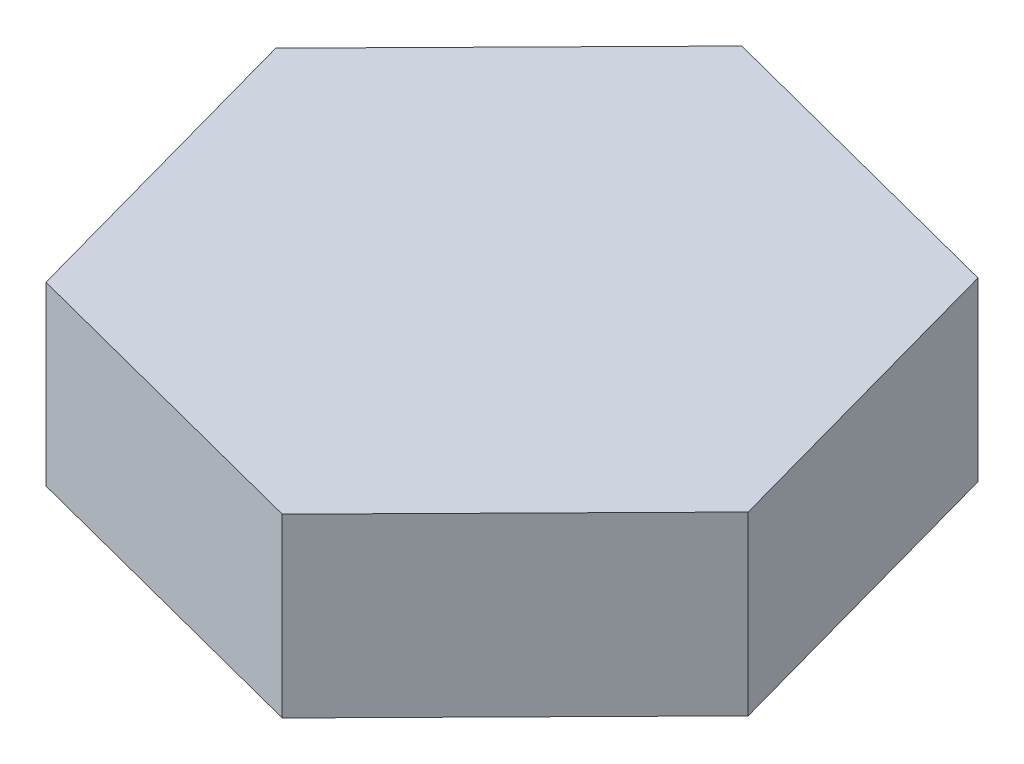
ISO-10303-21;
HEADER;
FILE_DESCRIPTION(('STEP AP214'),'2;1');
FILE_NAME('part.step','',(''),(''),'','','');
FILE_SCHEMA(('AUTOMOTIVE_DESIGN { 1 0 10303 214 1 1 1 1 }'));
ENDSEC;
DATA;
#1=APPLICATION_CONTEXT('core data for automotive mechanical design processes');
#2=APPLICATION_PROTOCOL_DEFINITION('international standard','automotive_design',2000,#1);
#3=PRODUCT_CONTEXT('',#1,'mechanical');
#4=PRODUCT('Part','Part','',(#3));
#5=PRODUCT_RELATED_PRODUCT_CATEGORY('part','',(#4));
#6=PRODUCT_DEFINITION_FORMATION('','',#4);
#7=PRODUCT_DEFINITION_CONTEXT('part definition',#1,'design');
#8=PRODUCT_DEFINITION('design','',#6,#7);
#9=PRODUCT_DEFINITION_SHAPE('','',#8);
#10=(LENGTH_UNIT() NAMED_UNIT(*) SI_UNIT(.MILLI.,.METRE.));
#11=(NAMED_UNIT(*) PLANE_ANGLE_UNIT() SI_UNIT($,.RADIAN.));
#12=(NAMED_UNIT(*) SI_UNIT($,.STERADIAN.) SOLID_ANGLE_UNIT());
#13=UNCERTAINTY_MEASURE_WITH_UNIT(LENGTH_MEASURE(1.E-05),#10,'distance_accuracy_value','');
#14=(GEOMETRIC_REPRESENTATION_CONTEXT(3) GLOBAL_UNCERTAINTY_ASSIGNED_CONTEXT((#13)) GLOBAL_UNIT_ASSIGNED_CONTEXT((#10,
#11,#12)) REPRESENTATION_CONTEXT('',''));
#15=CARTESIAN_POINT('',(0.,0.,0.));
#16=DIRECTION('',(0.,0.,1.));
#17=DIRECTION('',(1.,0.,0.));
#18=AXIS2_PLACEMENT_3D('',#15,#16,#17);
#19=CARTESIAN_POINT('',(22.1413968795443,3.,-2.38203916015197));
#20=DIRECTION('',(0.25103526460217,0.,-0.967977941859275));
#21=DIRECTION('',(-0.967977941859276,0.,-0.25103526460217));
#22=AXIS2_PLACEMENT_3D('',#19,#20,#21);
#23=PLANE('',#22);
#24=DIRECTION('',(0.967977941859275,0.,0.25103526460217));
#25=VECTOR('',#24,1.);
#26=CARTESIAN_POINT('',(22.1413968795443,0.,-2.38203916015197));
#27=LINE('',#26,#25);
#28=CARTESIAN_POINT('',(22.1413968795443,0.,-2.38203916015197));
#29=VERTEX_POINT('',#28);
#30=CARTESIAN_POINT('',(27.5623614349744,0.,-0.9761669674887));
#31=VERTEX_POINT('',#30);
#32=EDGE_CURVE('E117',#29,#31,#27,.T.);
#33=ORIENTED_EDGE('',*,*,#32,.T.);
#34=DIRECTION('',(0.,-1.,0.));
#35=VECTOR('',#34,1.);
#36=CARTESIAN_POINT('',(27.5623614349744,3.,-0.9761669674887));
#37=LINE('',#36,#35);
#38=CARTESIAN_POINT('',(27.5623614349744,3.,-0.9761669674887));
#39=VERTEX_POINT('',#38);
#40=EDGE_CURVE('E11',#39,#31,#37,.T.);
#41=ORIENTED_EDGE('',*,*,#40,.F.);
#42=DIRECTION('',(0.967977941859275,0.,0.25103526460217));
#43=VECTOR('',#42,1.);
#44=CARTESIAN_POINT('',(22.1413968795443,3.,-2.38203916015197));
#45=LINE('',#44,#43);
#46=CARTESIAN_POINT('',(22.1413968795443,3.,-2.38203916015197));
#47=VERTEX_POINT('',#46);
#48=EDGE_CURVE('E127',#47,#39,#45,.T.);
#49=ORIENTED_EDGE('',*,*,#48,.F.);
#50=DIRECTION('',(0.,-1.,0.));
#51=VECTOR('',#50,1.);
#52=CARTESIAN_POINT('',(22.1413968795443,3.,-2.38203916015197));
#53=LINE('',#52,#51);
#54=EDGE_CURVE('E113',#47,#29,#53,.T.);
#55=ORIENTED_EDGE('',*,*,#54,.T.);
#56=EDGE_LOOP('',(#33,#41,#49,#55));
#57=FACE_BOUND('',#56,.T.);
#58=ADVANCED_FACE('F33',(#57),#23,.F.);
#59=CARTESIAN_POINT('',(27.5623614349744,3.,-0.9761669674887));
#60=DIRECTION('',(-0.712775855652024,0.,-0.701391887320865));
#61=DIRECTION('',(-0.701391887320865,0.,0.712775855652024));
#62=AXIS2_PLACEMENT_3D('',#59,#60,#61);
#63=PLANE('',#62);
#64=DIRECTION('',(0.701391887320865,0.,-0.712775855652024));
#65=VECTOR('',#64,1.);
#66=CARTESIAN_POINT('',(27.5623614349744,0.,-0.9761669674887));
#67=LINE('',#66,#65);
#68=CARTESIAN_POINT('',(31.49036474601,0.,-4.96792388917455));
#69=VERTEX_POINT('',#68);
#70=EDGE_CURVE('E120',#31,#69,#67,.T.);
#71=ORIENTED_EDGE('',*,*,#70,.T.);
#72=DIRECTION('',(0.,-1.,0.));
#73=VECTOR('',#72,1.);
#74=CARTESIAN_POINT('',(31.49036474601,3.,-4.96792388917455));
#75=LINE('',#74,#73);
#76=CARTESIAN_POINT('',(31.49036474601,3.,-4.96792388917455));
#77=VERTEX_POINT('',#76);
#78=EDGE_CURVE('E41',#77,#69,#75,.T.);
#79=ORIENTED_EDGE('',*,*,#78,.F.);
#80=DIRECTION('',(0.701391887320865,0.,-0.712775855652024));
#81=VECTOR('',#80,1.);
#82=CARTESIAN_POINT('',(27.5623614349744,3.,-0.9761669674887));
#83=LINE('',#82,#81);
#84=EDGE_CURVE('E86',#39,#77,#83,.T.);
#85=ORIENTED_EDGE('',*,*,#84,.F.);
#86=ORIENTED_EDGE('',*,*,#40,.T.);
#87=EDGE_LOOP('',(#71,#79,#85,#86));
#88=FACE_BOUND('',#87,.T.);
#89=ADVANCED_FACE('F151',(#88),#63,.F.);
#90=CARTESIAN_POINT('',(31.49036474601,3.,-4.96792388917455));
#91=DIRECTION('',(-0.963811120254194,0.,0.26658605453841));
#92=DIRECTION('',(0.26658605453841,0.,0.963811120254194));
#93=AXIS2_PLACEMENT_3D('',#90,#91,#92);
#94=PLANE('',#93);
#95=DIRECTION('',(-0.26658605453841,0.,-0.963811120254194));
#96=VECTOR('',#95,1.);
#97=CARTESIAN_POINT('',(31.49036474601,0.,-4.96792388917455));
#98=LINE('',#97,#96);
#99=CARTESIAN_POINT('',(29.9974035016154,0.,-10.3655530035237));
#100=VERTEX_POINT('',#99);
#101=EDGE_CURVE('E122',#69,#100,#98,.T.);
#102=ORIENTED_EDGE('',*,*,#101,.T.);
#103=DIRECTION('',(0.,-1.,0.));
#104=VECTOR('',#103,1.);
#105=CARTESIAN_POINT('',(29.9974035016154,3.,-10.3655530035237));
#106=LINE('',#105,#104);
#107=CARTESIAN_POINT('',(29.9974035016154,3.,-10.3655530035237));
#108=VERTEX_POINT('',#107);
#109=EDGE_CURVE('E108',#108,#100,#106,.T.);
#110=ORIENTED_EDGE('',*,*,#109,.F.);
#111=DIRECTION('',(-0.26658605453841,0.,-0.963811120254194));
#112=VECTOR('',#111,1.);
#113=CARTESIAN_POINT('',(31.49036474601,3.,-4.96792388917455));
#114=LINE('',#113,#112);
#115=EDGE_CURVE('E99',#77,#108,#114,.T.);
#116=ORIENTED_EDGE('',*,*,#115,.F.);
#117=ORIENTED_EDGE('',*,*,#78,.T.);
#118=EDGE_LOOP('',(#102,#110,#116,#117));
#119=FACE_BOUND('',#118,.T.);
#120=ADVANCED_FACE('F133',(#119),#94,.F.);
#121=CARTESIAN_POINT('',(29.9974035016154,3.,-10.3655530035237));
#122=DIRECTION('',(-0.25103526460217,0.,0.967977941859275));
#123=DIRECTION('',(0.967977941859276,0.,0.25103526460217));
#124=AXIS2_PLACEMENT_3D('',#121,#122,#123);
#125=PLANE('',#124);
#126=DIRECTION('',(-0.967977941859275,0.,-0.25103526460217));
#127=VECTOR('',#126,1.);
#128=CARTESIAN_POINT('',(29.9974035016154,0.,-10.3655530035237));
#129=LINE('',#128,#127);
#130=CARTESIAN_POINT('',(24.5764389461853,0.,-11.7714251961869));
#131=VERTEX_POINT('',#130);
#132=EDGE_CURVE('E107',#100,#131,#129,.T.);
#133=ORIENTED_EDGE('',*,*,#132,.T.);
#134=DIRECTION('',(0.,-1.,0.));
#135=VECTOR('',#134,1.);
#136=CARTESIAN_POINT('',(24.5764389461853,3.,-11.7714251961869));
#137=LINE('',#136,#135);
#138=CARTESIAN_POINT('',(24.5764389461853,3.,-11.7714251961869));
#139=VERTEX_POINT('',#138);
#140=EDGE_CURVE('E104',#139,#131,#137,.T.);
#141=ORIENTED_EDGE('',*,*,#140,.F.);
#142=DIRECTION('',(-0.967977941859275,0.,-0.25103526460217));
#143=VECTOR('',#142,1.);
#144=CARTESIAN_POINT('',(29.9974035016154,3.,-10.3655530035237));
#145=LINE('',#144,#143);
#146=EDGE_CURVE('E93',#108,#139,#145,.T.);
#147=ORIENTED_EDGE('',*,*,#146,.F.);
#148=ORIENTED_EDGE('',*,*,#109,.T.);
#149=EDGE_LOOP('',(#133,#141,#147,#148));
#150=FACE_BOUND('',#149,.T.);
#151=ADVANCED_FACE('F105',(#150),#125,.F.);
#152=CARTESIAN_POINT('',(24.5764389461853,3.,-11.7714251961869));
#153=DIRECTION('',(0.712775855652024,0.,0.701391887320865));
#154=DIRECTION('',(0.701391887320865,0.,-0.712775855652024));
#155=AXIS2_PLACEMENT_3D('',#152,#153,#154);
#156=PLANE('',#155);
#157=DIRECTION('',(-0.701391887320865,0.,0.712775855652024));
#158=VECTOR('',#157,1.);
#159=CARTESIAN_POINT('',(24.5764389461853,0.,-11.7714251961869));
#160=LINE('',#159,#158);
#161=CARTESIAN_POINT('',(20.6484356351498,0.,-7.77966827450109));
#162=VERTEX_POINT('',#161);
#163=EDGE_CURVE('E72',#131,#162,#160,.T.);
#164=ORIENTED_EDGE('',*,*,#163,.T.);
#165=DIRECTION('',(0.,-1.,0.));
#166=VECTOR('',#165,1.);
#167=CARTESIAN_POINT('',(20.6484356351498,3.,-7.77966827450109));
#168=LINE('',#167,#166);
#169=CARTESIAN_POINT('',(20.6484356351498,3.,-7.77966827450109));
#170=VERTEX_POINT('',#169);
#171=EDGE_CURVE('E109',#170,#162,#168,.T.);
#172=ORIENTED_EDGE('',*,*,#171,.F.);
#173=DIRECTION('',(-0.701391887320865,0.,0.712775855652024));
#174=VECTOR('',#173,1.);
#175=CARTESIAN_POINT('',(24.5764389461853,3.,-11.7714251961869));
#176=LINE('',#175,#174);
#177=EDGE_CURVE('E97',#139,#170,#176,.T.);
#178=ORIENTED_EDGE('',*,*,#177,.F.);
#179=ORIENTED_EDGE('',*,*,#140,.T.);
#180=EDGE_LOOP('',(#164,#172,#178,#179));
#181=FACE_BOUND('',#180,.T.);
#182=ADVANCED_FACE('F111',(#181),#156,.F.);
#183=CARTESIAN_POINT('',(20.6484356351498,3.,-7.77966827450109));
#184=DIRECTION('',(0.963811120254194,0.,-0.266586054538411));
#185=DIRECTION('',(-0.266586054538411,0.,-0.963811120254194));
#186=AXIS2_PLACEMENT_3D('',#183,#184,#185);
#187=PLANE('',#186);
#188=DIRECTION('',(0.266586054538411,0.,0.963811120254194));
#189=VECTOR('',#188,1.);
#190=CARTESIAN_POINT('',(20.6484356351498,0.,-7.77966827450109));
#191=LINE('',#190,#189);
#192=EDGE_CURVE('E78',#162,#29,#191,.T.);
#193=ORIENTED_EDGE('',*,*,#192,.T.);
#194=ORIENTED_EDGE('',*,*,#54,.F.);
#195=DIRECTION('',(0.266586054538411,0.,0.963811120254194));
#196=VECTOR('',#195,1.);
#197=CARTESIAN_POINT('',(20.6484356351498,3.,-7.77966827450109));
#198=LINE('',#197,#196);
#199=EDGE_CURVE('E49',#170,#47,#198,.T.);
#200=ORIENTED_EDGE('',*,*,#199,.F.);
#201=ORIENTED_EDGE('',*,*,#171,.T.);
#202=EDGE_LOOP('',(#193,#194,#200,#201));
#203=FACE_BOUND('',#202,.T.);
#204=ADVANCED_FACE('F140',(#203),#187,.F.);
#205=CARTESIAN_POINT('',(0.,3.,0.));
#206=DIRECTION('',(0.,1.,0.));
#207=DIRECTION('',(0.,0.,1.));
#208=AXIS2_PLACEMENT_3D('',#205,#206,#207);
#209=PLANE('',#208);
#210=ORIENTED_EDGE('',*,*,#48,.T.);
#211=ORIENTED_EDGE('',*,*,#84,.T.);
#212=ORIENTED_EDGE('',*,*,#115,.T.);
#213=ORIENTED_EDGE('',*,*,#146,.T.);
#214=ORIENTED_EDGE('',*,*,#177,.T.);
#215=ORIENTED_EDGE('',*,*,#199,.T.);
#216=EDGE_LOOP('',(#210,#211,#212,#213,#214,#215));
#217=FACE_BOUND('',#216,.T.);
#218=ADVANCED_FACE('F95',(#217),#209,.T.);
#219=CARTESIAN_POINT('',(0.,0.,0.));
#220=DIRECTION('',(0.,1.,0.));
#221=DIRECTION('',(0.,0.,1.));
#222=AXIS2_PLACEMENT_3D('',#219,#220,#221);
#223=PLANE('',#222);
#224=ORIENTED_EDGE('',*,*,#32,.F.);
#225=ORIENTED_EDGE('',*,*,#192,.F.);
#226=ORIENTED_EDGE('',*,*,#163,.F.);
#227=ORIENTED_EDGE('',*,*,#132,.F.);
#228=ORIENTED_EDGE('',*,*,#101,.F.);
#229=ORIENTED_EDGE('',*,*,#70,.F.);
#230=EDGE_LOOP('',(#224,#225,#226,#227,#228,#229));
#231=FACE_BOUND('',#230,.T.);
#232=ADVANCED_FACE('F136',(#231),#223,.F.);
#233=CLOSED_SHELL('',(#58,#89,#120,#151,#182,#204,#218,#232));
#234=MANIFOLD_SOLID_BREP('B2',#233);
#235=ADVANCED_BREP_SHAPE_REPRESENTATION('',(#18,#234),#14);
#236=SHAPE_DEFINITION_REPRESENTATION(#9,#235);
ENDSEC;
END-ISO-10303-21;
